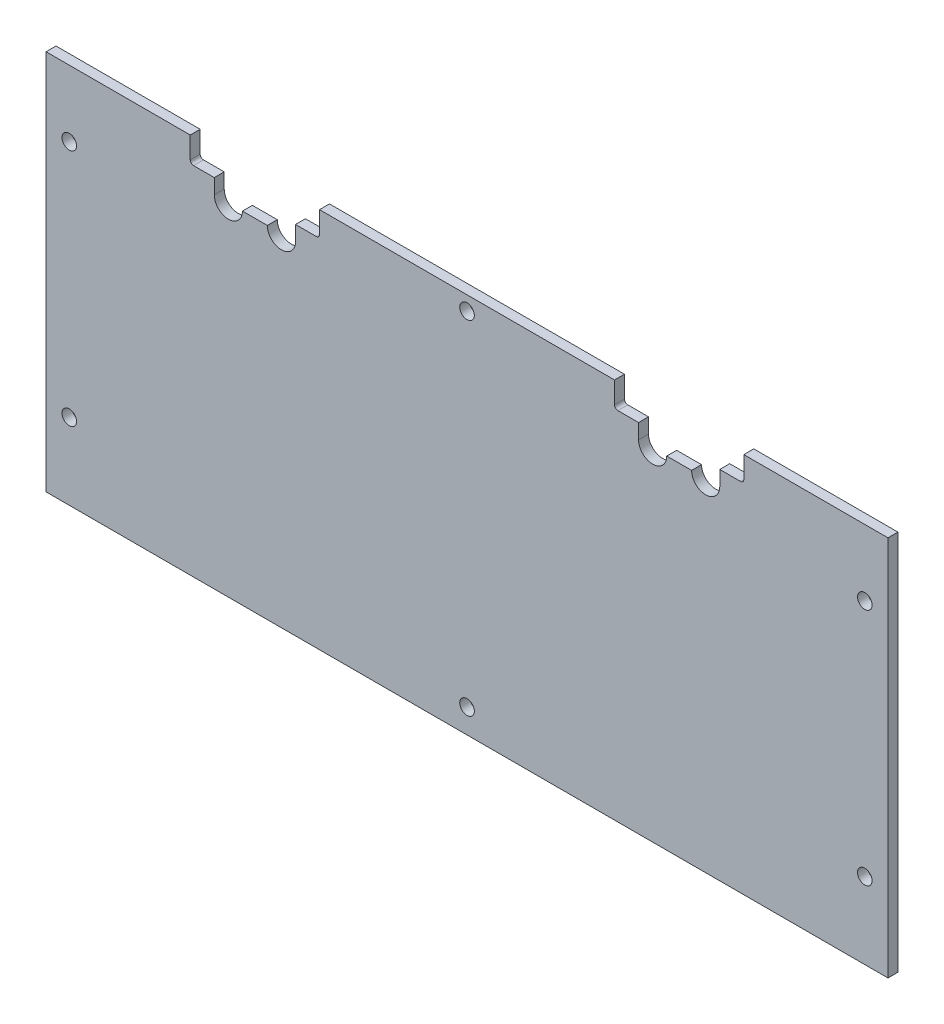
ISO-10303-21;
HEADER;
FILE_DESCRIPTION(('STEP AP214'),'2;1');
FILE_NAME('part.step','',(''),(''),'','','');
FILE_SCHEMA(('AUTOMOTIVE_DESIGN { 1 0 10303 214 1 1 1 1 }'));
ENDSEC;
DATA;
#1=APPLICATION_CONTEXT('core data for automotive mechanical design processes');
#2=APPLICATION_PROTOCOL_DEFINITION('international standard','automotive_design',2000,#1);
#3=PRODUCT_CONTEXT('',#1,'mechanical');
#4=PRODUCT('Part','Part','',(#3));
#5=PRODUCT_RELATED_PRODUCT_CATEGORY('part','',(#4));
#6=PRODUCT_DEFINITION_FORMATION('','',#4);
#7=PRODUCT_DEFINITION_CONTEXT('part definition',#1,'design');
#8=PRODUCT_DEFINITION('design','',#6,#7);
#9=PRODUCT_DEFINITION_SHAPE('','',#8);
#10=(LENGTH_UNIT() NAMED_UNIT(*) SI_UNIT(.MILLI.,.METRE.));
#11=(NAMED_UNIT(*) PLANE_ANGLE_UNIT() SI_UNIT($,.RADIAN.));
#12=(NAMED_UNIT(*) SI_UNIT($,.STERADIAN.) SOLID_ANGLE_UNIT());
#13=UNCERTAINTY_MEASURE_WITH_UNIT(LENGTH_MEASURE(1.E-05),#10,'distance_accuracy_value','');
#14=(GEOMETRIC_REPRESENTATION_CONTEXT(3) GLOBAL_UNCERTAINTY_ASSIGNED_CONTEXT((#13)) GLOBAL_UNIT_ASSIGNED_CONTEXT((#10,
#11,#12)) REPRESENTATION_CONTEXT('',''));
#15=CARTESIAN_POINT('',(0.,0.,0.));
#16=DIRECTION('',(0.,0.,1.));
#17=DIRECTION('',(1.,0.,0.));
#18=AXIS2_PLACEMENT_3D('',#15,#16,#17);
#19=CARTESIAN_POINT('',(83.5,56.,0.));
#20=DIRECTION('',(0.,1.,0.));
#21=DIRECTION('',(1.,0.,0.));
#22=AXIS2_PLACEMENT_3D('',#19,#20,#21);
#23=PLANE('',#22);
#24=DIRECTION('',(0.,0.,1.));
#25=VECTOR('',#24,1.);
#26=CARTESIAN_POINT('',(83.5,56.,0.));
#27=LINE('',#26,#25);
#28=CARTESIAN_POINT('',(83.5,56.,0.));
#29=VERTEX_POINT('',#28);
#30=CARTESIAN_POINT('',(83.5,56.,3.));
#31=VERTEX_POINT('',#30);
#32=EDGE_CURVE('E390',#29,#31,#27,.T.);
#33=ORIENTED_EDGE('',*,*,#32,.T.);
#34=DIRECTION('',(1.,0.,0.));
#35=VECTOR('',#34,1.);
#36=CARTESIAN_POINT('',(83.5,56.,3.));
#37=LINE('',#36,#35);
#38=CARTESIAN_POINT('',(127.,56.,3.));
#39=VERTEX_POINT('',#38);
#40=EDGE_CURVE('E372',#31,#39,#37,.T.);
#41=ORIENTED_EDGE('',*,*,#40,.T.);
#42=DIRECTION('',(0.,0.,1.));
#43=VECTOR('',#42,1.);
#44=CARTESIAN_POINT('',(127.,56.,0.));
#45=LINE('',#44,#43);
#46=CARTESIAN_POINT('',(127.,56.,0.));
#47=VERTEX_POINT('',#46);
#48=EDGE_CURVE('E11',#47,#39,#45,.T.);
#49=ORIENTED_EDGE('',*,*,#48,.F.);
#50=DIRECTION('',(1.,0.,0.));
#51=VECTOR('',#50,1.);
#52=CARTESIAN_POINT('',(83.5,56.,0.));
#53=LINE('',#52,#51);
#54=EDGE_CURVE('E412',#29,#47,#53,.T.);
#55=ORIENTED_EDGE('',*,*,#54,.F.);
#56=EDGE_LOOP('',(#33,#41,#49,#55));
#57=FACE_BOUND('',#56,.T.);
#58=ADVANCED_FACE('F17',(#57),#23,.T.);
#59=CARTESIAN_POINT('',(127.,56.,0.));
#60=DIRECTION('',(1.,0.,0.));
#61=DIRECTION('',(0.,1.,0.));
#62=AXIS2_PLACEMENT_3D('',#59,#60,#61);
#63=PLANE('',#62);
#64=ORIENTED_EDGE('',*,*,#48,.T.);
#65=DIRECTION('',(0.,-1.,0.));
#66=VECTOR('',#65,1.);
#67=CARTESIAN_POINT('',(127.,56.,3.));
#68=LINE('',#67,#66);
#69=CARTESIAN_POINT('',(127.,-59.,3.));
#70=VERTEX_POINT('',#69);
#71=EDGE_CURVE('E368',#39,#70,#68,.T.);
#72=ORIENTED_EDGE('',*,*,#71,.T.);
#73=DIRECTION('',(0.,0.,1.));
#74=VECTOR('',#73,1.);
#75=CARTESIAN_POINT('',(127.,-59.,0.));
#76=LINE('',#75,#74);
#77=CARTESIAN_POINT('',(127.,-59.,0.));
#78=VERTEX_POINT('',#77);
#79=EDGE_CURVE('E27',#78,#70,#76,.T.);
#80=ORIENTED_EDGE('',*,*,#79,.F.);
#81=DIRECTION('',(0.,-1.,0.));
#82=VECTOR('',#81,1.);
#83=CARTESIAN_POINT('',(127.,56.,0.));
#84=LINE('',#83,#82);
#85=EDGE_CURVE('E416',#47,#78,#84,.T.);
#86=ORIENTED_EDGE('',*,*,#85,.F.);
#87=EDGE_LOOP('',(#64,#72,#80,#86));
#88=FACE_BOUND('',#87,.T.);
#89=ADVANCED_FACE('F1040',(#88),#63,.T.);
#90=CARTESIAN_POINT('',(127.,-59.,0.));
#91=DIRECTION('',(0.,-1.,0.));
#92=DIRECTION('',(0.,0.,-1.));
#93=AXIS2_PLACEMENT_3D('',#90,#91,#92);
#94=PLANE('',#93);
#95=ORIENTED_EDGE('',*,*,#79,.T.);
#96=DIRECTION('',(-1.,0.,0.));
#97=VECTOR('',#96,1.);
#98=CARTESIAN_POINT('',(127.,-59.,3.));
#99=LINE('',#98,#97);
#100=CARTESIAN_POINT('',(-127.,-59.,3.));
#101=VERTEX_POINT('',#100);
#102=EDGE_CURVE('E364',#70,#101,#99,.T.);
#103=ORIENTED_EDGE('',*,*,#102,.T.);
#104=DIRECTION('',(0.,0.,1.));
#105=VECTOR('',#104,1.);
#106=CARTESIAN_POINT('',(-127.,-59.,0.));
#107=LINE('',#106,#105);
#108=CARTESIAN_POINT('',(-127.,-59.,0.));
#109=VERTEX_POINT('',#108);
#110=EDGE_CURVE('E21',#109,#101,#107,.T.);
#111=ORIENTED_EDGE('',*,*,#110,.F.);
#112=DIRECTION('',(-1.,0.,0.));
#113=VECTOR('',#112,1.);
#114=CARTESIAN_POINT('',(127.,-59.,0.));
#115=LINE('',#114,#113);
#116=EDGE_CURVE('E422',#78,#109,#115,.T.);
#117=ORIENTED_EDGE('',*,*,#116,.F.);
#118=EDGE_LOOP('',(#95,#103,#111,#117));
#119=FACE_BOUND('',#118,.T.);
#120=ADVANCED_FACE('F1047',(#119),#94,.T.);
#121=CARTESIAN_POINT('',(-127.,-59.,0.));
#122=DIRECTION('',(-1.,0.,0.));
#123=DIRECTION('',(0.,0.,1.));
#124=AXIS2_PLACEMENT_3D('',#121,#122,#123);
#125=PLANE('',#124);
#126=ORIENTED_EDGE('',*,*,#110,.T.);
#127=DIRECTION('',(0.,1.,0.));
#128=VECTOR('',#127,1.);
#129=CARTESIAN_POINT('',(-127.,-59.,3.));
#130=LINE('',#129,#128);
#131=CARTESIAN_POINT('',(-127.,56.,3.));
#132=VERTEX_POINT('',#131);
#133=EDGE_CURVE('E360',#101,#132,#130,.T.);
#134=ORIENTED_EDGE('',*,*,#133,.T.);
#135=DIRECTION('',(0.,0.,1.));
#136=VECTOR('',#135,1.);
#137=CARTESIAN_POINT('',(-127.,56.,0.));
#138=LINE('',#137,#136);
#139=CARTESIAN_POINT('',(-127.,56.,0.));
#140=VERTEX_POINT('',#139);
#141=EDGE_CURVE('E427',#140,#132,#138,.T.);
#142=ORIENTED_EDGE('',*,*,#141,.F.);
#143=DIRECTION('',(0.,1.,0.));
#144=VECTOR('',#143,1.);
#145=CARTESIAN_POINT('',(-127.,-59.,0.));
#146=LINE('',#145,#144);
#147=EDGE_CURVE('E417',#109,#140,#146,.T.);
#148=ORIENTED_EDGE('',*,*,#147,.F.);
#149=EDGE_LOOP('',(#126,#134,#142,#148));
#150=FACE_BOUND('',#149,.T.);
#151=ADVANCED_FACE('F19',(#150),#125,.T.);
#152=CARTESIAN_POINT('',(83.5,56.,0.));
#153=DIRECTION('',(0.,1.,0.));
#154=DIRECTION('',(1.,0.,0.));
#155=AXIS2_PLACEMENT_3D('',#152,#153,#154);
#156=PLANE('',#155);
#157=ORIENTED_EDGE('',*,*,#141,.T.);
#158=DIRECTION('',(1.,0.,0.));
#159=VECTOR('',#158,1.);
#160=CARTESIAN_POINT('',(83.5,56.,3.));
#161=LINE('',#160,#159);
#162=CARTESIAN_POINT('',(-83.5,56.,3.));
#163=VERTEX_POINT('',#162);
#164=EDGE_CURVE('E356',#132,#163,#161,.T.);
#165=ORIENTED_EDGE('',*,*,#164,.T.);
#166=DIRECTION('',(0.,0.,1.));
#167=VECTOR('',#166,1.);
#168=CARTESIAN_POINT('',(-83.5,56.,0.));
#169=LINE('',#168,#167);
#170=CARTESIAN_POINT('',(-83.5,56.,0.));
#171=VERTEX_POINT('',#170);
#172=EDGE_CURVE('E430',#171,#163,#169,.T.);
#173=ORIENTED_EDGE('',*,*,#172,.F.);
#174=DIRECTION('',(1.,0.,0.));
#175=VECTOR('',#174,1.);
#176=CARTESIAN_POINT('',(0.,56.,0.));
#177=LINE('',#176,#175);
#178=EDGE_CURVE('E421',#140,#171,#177,.T.);
#179=ORIENTED_EDGE('',*,*,#178,.F.);
#180=EDGE_LOOP('',(#157,#165,#173,#179));
#181=FACE_BOUND('',#180,.T.);
#182=ADVANCED_FACE('F1116',(#181),#156,.T.);
#183=CARTESIAN_POINT('',(-83.5,56.,0.));
#184=DIRECTION('',(1.,0.,0.));
#185=DIRECTION('',(0.,1.,0.));
#186=AXIS2_PLACEMENT_3D('',#183,#184,#185);
#187=PLANE('',#186);
#188=ORIENTED_EDGE('',*,*,#172,.T.);
#189=DIRECTION('',(0.,-1.,0.));
#190=VECTOR('',#189,1.);
#191=CARTESIAN_POINT('',(-83.5,56.,3.));
#192=LINE('',#191,#190);
#193=CARTESIAN_POINT('',(-83.5,49.5,3.));
#194=VERTEX_POINT('',#193);
#195=EDGE_CURVE('E336',#163,#194,#192,.T.);
#196=ORIENTED_EDGE('',*,*,#195,.T.);
#197=DIRECTION('',(0.,0.,1.));
#198=VECTOR('',#197,1.);
#199=CARTESIAN_POINT('',(-83.5,49.5,0.));
#200=LINE('',#199,#198);
#201=CARTESIAN_POINT('',(-83.5,49.5,0.));
#202=VERTEX_POINT('',#201);
#203=EDGE_CURVE('E327',#202,#194,#200,.T.);
#204=ORIENTED_EDGE('',*,*,#203,.F.);
#205=DIRECTION('',(0.,-1.,0.));
#206=VECTOR('',#205,1.);
#207=CARTESIAN_POINT('',(-83.5,56.,0.));
#208=LINE('',#207,#206);
#209=EDGE_CURVE('E426',#171,#202,#208,.T.);
#210=ORIENTED_EDGE('',*,*,#209,.F.);
#211=EDGE_LOOP('',(#188,#196,#204,#210));
#212=FACE_BOUND('',#211,.T.);
#213=ADVANCED_FACE('F1112',(#212),#187,.T.);
#214=CARTESIAN_POINT('',(-82.5,49.5,0.));
#215=DIRECTION('',(0.,0.,-1.));
#216=DIRECTION('',(1.,0.,0.));
#217=AXIS2_PLACEMENT_3D('',#214,#215,#216);
#218=CYLINDRICAL_SURFACE('',#217,1.);
#219=ORIENTED_EDGE('',*,*,#203,.T.);
#220=CARTESIAN_POINT('',(-82.5,49.5,3.));
#221=DIRECTION('',(0.,0.,1.));
#222=DIRECTION('',(1.,0.,0.));
#223=AXIS2_PLACEMENT_3D('',#220,#221,#222);
#224=CIRCLE('',#223,1.);
#225=CARTESIAN_POINT('',(-82.5,48.5,3.));
#226=VERTEX_POINT('',#225);
#227=EDGE_CURVE('E330',#194,#226,#224,.T.);
#228=ORIENTED_EDGE('',*,*,#227,.T.);
#229=DIRECTION('',(0.,0.,1.));
#230=VECTOR('',#229,1.);
#231=CARTESIAN_POINT('',(-82.5,48.5,0.));
#232=LINE('',#231,#230);
#233=CARTESIAN_POINT('',(-82.5,48.5,0.));
#234=VERTEX_POINT('',#233);
#235=EDGE_CURVE('E315',#234,#226,#232,.T.);
#236=ORIENTED_EDGE('',*,*,#235,.F.);
#237=CARTESIAN_POINT('',(-82.5,49.5,0.));
#238=DIRECTION('',(0.,0.,1.));
#239=DIRECTION('',(1.,0.,0.));
#240=AXIS2_PLACEMENT_3D('',#237,#238,#239);
#241=CIRCLE('',#240,1.);
#242=EDGE_CURVE('E434',#202,#234,#241,.T.);
#243=ORIENTED_EDGE('',*,*,#242,.F.);
#244=EDGE_LOOP('',(#219,#228,#236,#243));
#245=FACE_BOUND('',#244,.T.);
#246=ADVANCED_FACE('F331',(#245),#218,.F.);
#247=CARTESIAN_POINT('',(-82.5,48.5,0.));
#248=DIRECTION('',(0.,1.,0.));
#249=DIRECTION('',(1.,0.,0.));
#250=AXIS2_PLACEMENT_3D('',#247,#248,#249);
#251=PLANE('',#250);
#252=ORIENTED_EDGE('',*,*,#235,.T.);
#253=DIRECTION('',(1.,0.,0.));
#254=VECTOR('',#253,1.);
#255=CARTESIAN_POINT('',(-82.5,48.5,3.));
#256=LINE('',#255,#254);
#257=CARTESIAN_POINT('',(-76.25,48.5,3.));
#258=VERTEX_POINT('',#257);
#259=EDGE_CURVE('E319',#226,#258,#256,.T.);
#260=ORIENTED_EDGE('',*,*,#259,.T.);
#261=DIRECTION('',(0.,0.,1.));
#262=VECTOR('',#261,1.);
#263=CARTESIAN_POINT('',(-76.25,48.5,0.));
#264=LINE('',#263,#262);
#265=CARTESIAN_POINT('',(-76.25,48.5,0.));
#266=VERTEX_POINT('',#265);
#267=EDGE_CURVE('E328',#266,#258,#264,.T.);
#268=ORIENTED_EDGE('',*,*,#267,.F.);
#269=DIRECTION('',(1.,0.,0.));
#270=VECTOR('',#269,1.);
#271=CARTESIAN_POINT('',(-82.5,48.5,0.));
#272=LINE('',#271,#270);
#273=EDGE_CURVE('E322',#234,#266,#272,.T.);
#274=ORIENTED_EDGE('',*,*,#273,.F.);
#275=EDGE_LOOP('',(#252,#260,#268,#274));
#276=FACE_BOUND('',#275,.T.);
#277=ADVANCED_FACE('F317',(#276),#251,.T.);
#278=CARTESIAN_POINT('',(-76.25,48.5,0.));
#279=DIRECTION('',(1.,0.,0.));
#280=DIRECTION('',(0.,1.,0.));
#281=AXIS2_PLACEMENT_3D('',#278,#279,#280);
#282=PLANE('',#281);
#283=ORIENTED_EDGE('',*,*,#267,.T.);
#284=DIRECTION('',(0.,-1.,0.));
#285=VECTOR('',#284,1.);
#286=CARTESIAN_POINT('',(-76.25,48.5,3.));
#287=LINE('',#286,#285);
#288=CARTESIAN_POINT('',(-76.25,44.,3.));
#289=VERTEX_POINT('',#288);
#290=EDGE_CURVE('E343',#258,#289,#287,.T.);
#291=ORIENTED_EDGE('',*,*,#290,.T.);
#292=DIRECTION('',(0.,0.,1.));
#293=VECTOR('',#292,1.);
#294=CARTESIAN_POINT('',(-76.25,44.,0.));
#295=LINE('',#294,#293);
#296=CARTESIAN_POINT('',(-76.25,44.,0.));
#297=VERTEX_POINT('',#296);
#298=EDGE_CURVE('E403',#297,#289,#295,.T.);
#299=ORIENTED_EDGE('',*,*,#298,.F.);
#300=DIRECTION('',(0.,-1.,0.));
#301=VECTOR('',#300,1.);
#302=CARTESIAN_POINT('',(-76.25,48.5,0.));
#303=LINE('',#302,#301);
#304=EDGE_CURVE('E446',#266,#297,#303,.T.);
#305=ORIENTED_EDGE('',*,*,#304,.F.);
#306=EDGE_LOOP('',(#283,#291,#299,#305));
#307=FACE_BOUND('',#306,.T.);
#308=ADVANCED_FACE('F542',(#307),#282,.T.);
#309=CARTESIAN_POINT('',(-72.,44.,0.));
#310=DIRECTION('',(0.,0.,-1.));
#311=DIRECTION('',(1.,0.,0.));
#312=AXIS2_PLACEMENT_3D('',#309,#310,#311);
#313=CYLINDRICAL_SURFACE('',#312,4.25);
#314=ORIENTED_EDGE('',*,*,#298,.T.);
#315=CARTESIAN_POINT('',(-72.,44.,3.));
#316=DIRECTION('',(0.,0.,1.));
#317=DIRECTION('',(1.,0.,0.));
#318=AXIS2_PLACEMENT_3D('',#315,#316,#317);
#319=CIRCLE('',#318,4.25);
#320=CARTESIAN_POINT('',(-67.75,44.,3.));
#321=VERTEX_POINT('',#320);
#322=EDGE_CURVE('E350',#289,#321,#319,.T.);
#323=ORIENTED_EDGE('',*,*,#322,.T.);
#324=DIRECTION('',(0.,0.,1.));
#325=VECTOR('',#324,1.);
#326=CARTESIAN_POINT('',(-67.75,44.,0.));
#327=LINE('',#326,#325);
#328=CARTESIAN_POINT('',(-67.75,44.,0.));
#329=VERTEX_POINT('',#328);
#330=EDGE_CURVE('E527',#329,#321,#327,.T.);
#331=ORIENTED_EDGE('',*,*,#330,.F.);
#332=CARTESIAN_POINT('',(-72.,44.,0.));
#333=DIRECTION('',(0.,0.,1.));
#334=DIRECTION('',(1.,0.,0.));
#335=AXIS2_PLACEMENT_3D('',#332,#333,#334);
#336=CIRCLE('',#335,4.25);
#337=EDGE_CURVE('E456',#297,#329,#336,.T.);
#338=ORIENTED_EDGE('',*,*,#337,.F.);
#339=EDGE_LOOP('',(#314,#323,#331,#338));
#340=FACE_BOUND('',#339,.T.);
#341=ADVANCED_FACE('F537',(#340),#313,.F.);
#342=CARTESIAN_POINT('',(-67.75,44.,0.));
#343=DIRECTION('',(0.,1.,0.));
#344=DIRECTION('',(1.,0.,0.));
#345=AXIS2_PLACEMENT_3D('',#342,#343,#344);
#346=PLANE('',#345);
#347=ORIENTED_EDGE('',*,*,#330,.T.);
#348=DIRECTION('',(1.,0.,0.));
#349=VECTOR('',#348,1.);
#350=CARTESIAN_POINT('',(-67.75,44.,3.));
#351=LINE('',#350,#349);
#352=CARTESIAN_POINT('',(-60.25,44.,3.));
#353=VERTEX_POINT('',#352);
#354=EDGE_CURVE('E545',#321,#353,#351,.T.);
#355=ORIENTED_EDGE('',*,*,#354,.T.);
#356=DIRECTION('',(0.,0.,1.));
#357=VECTOR('',#356,1.);
#358=CARTESIAN_POINT('',(-60.25,44.,0.));
#359=LINE('',#358,#357);
#360=CARTESIAN_POINT('',(-60.25,44.,0.));
#361=VERTEX_POINT('',#360);
#362=EDGE_CURVE('E524',#361,#353,#359,.T.);
#363=ORIENTED_EDGE('',*,*,#362,.F.);
#364=DIRECTION('',(1.,0.,0.));
#365=VECTOR('',#364,1.);
#366=CARTESIAN_POINT('',(-67.75,44.,0.));
#367=LINE('',#366,#365);
#368=EDGE_CURVE('E378',#329,#361,#367,.T.);
#369=ORIENTED_EDGE('',*,*,#368,.F.);
#370=EDGE_LOOP('',(#347,#355,#363,#369));
#371=FACE_BOUND('',#370,.T.);
#372=ADVANCED_FACE('F1098',(#371),#346,.T.);
#373=CARTESIAN_POINT('',(-56.,44.,0.));
#374=DIRECTION('',(0.,0.,-1.));
#375=DIRECTION('',(1.,0.,0.));
#376=AXIS2_PLACEMENT_3D('',#373,#374,#375);
#377=CYLINDRICAL_SURFACE('',#376,4.25);
#378=ORIENTED_EDGE('',*,*,#362,.T.);
#379=CARTESIAN_POINT('',(-56.,44.,3.));
#380=DIRECTION('',(0.,0.,1.));
#381=DIRECTION('',(1.,0.,0.));
#382=AXIS2_PLACEMENT_3D('',#379,#380,#381);
#383=CIRCLE('',#382,4.25);
#384=CARTESIAN_POINT('',(-51.75,44.,3.));
#385=VERTEX_POINT('',#384);
#386=EDGE_CURVE('E551',#353,#385,#383,.T.);
#387=ORIENTED_EDGE('',*,*,#386,.T.);
#388=DIRECTION('',(0.,0.,1.));
#389=VECTOR('',#388,1.);
#390=CARTESIAN_POINT('',(-51.75,44.,0.));
#391=LINE('',#390,#389);
#392=CARTESIAN_POINT('',(-51.75,44.,0.));
#393=VERTEX_POINT('',#392);
#394=EDGE_CURVE('E528',#393,#385,#391,.T.);
#395=ORIENTED_EDGE('',*,*,#394,.F.);
#396=CARTESIAN_POINT('',(-56.,44.,0.));
#397=DIRECTION('',(0.,0.,1.));
#398=DIRECTION('',(1.,0.,0.));
#399=AXIS2_PLACEMENT_3D('',#396,#397,#398);
#400=CIRCLE('',#399,4.25);
#401=EDGE_CURVE('E373',#361,#393,#400,.T.);
#402=ORIENTED_EDGE('',*,*,#401,.F.);
#403=EDGE_LOOP('',(#378,#387,#395,#402));
#404=FACE_BOUND('',#403,.T.);
#405=ADVANCED_FACE('F1068',(#404),#377,.F.);
#406=CARTESIAN_POINT('',(-51.75,48.5,0.));
#407=DIRECTION('',(1.,0.,0.));
#408=DIRECTION('',(0.,1.,0.));
#409=AXIS2_PLACEMENT_3D('',#406,#407,#408);
#410=PLANE('',#409);
#411=DIRECTION('',(0.,-1.,0.));
#412=VECTOR('',#411,1.);
#413=CARTESIAN_POINT('',(-51.75,48.5,0.));
#414=LINE('',#413,#412);
#415=CARTESIAN_POINT('',(-51.75,48.5,0.));
#416=VERTEX_POINT('',#415);
#417=EDGE_CURVE('E377',#416,#393,#414,.T.);
#418=ORIENTED_EDGE('',*,*,#417,.T.);
#419=ORIENTED_EDGE('',*,*,#394,.T.);
#420=DIRECTION('',(0.,-1.,0.));
#421=VECTOR('',#420,1.);
#422=CARTESIAN_POINT('',(-51.75,48.5,3.));
#423=LINE('',#422,#421);
#424=CARTESIAN_POINT('',(-51.75,48.5,3.));
#425=VERTEX_POINT('',#424);
#426=EDGE_CURVE('E575',#425,#385,#423,.T.);
#427=ORIENTED_EDGE('',*,*,#426,.F.);
#428=DIRECTION('',(0.,0.,1.));
#429=VECTOR('',#428,1.);
#430=CARTESIAN_POINT('',(-51.75,48.5,0.));
#431=LINE('',#430,#429);
#432=EDGE_CURVE('E523',#416,#425,#431,.T.);
#433=ORIENTED_EDGE('',*,*,#432,.F.);
#434=EDGE_LOOP('',(#418,#419,#427,#433));
#435=FACE_BOUND('',#434,.T.);
#436=ADVANCED_FACE('F1064',(#435),#410,.F.);
#437=CARTESIAN_POINT('',(-82.5,48.5,0.));
#438=DIRECTION('',(0.,1.,0.));
#439=DIRECTION('',(1.,0.,0.));
#440=AXIS2_PLACEMENT_3D('',#437,#438,#439);
#441=PLANE('',#440);
#442=ORIENTED_EDGE('',*,*,#432,.T.);
#443=DIRECTION('',(1.,0.,0.));
#444=VECTOR('',#443,1.);
#445=CARTESIAN_POINT('',(-82.5,48.5,3.));
#446=LINE('',#445,#444);
#447=CARTESIAN_POINT('',(-45.5,48.5,3.));
#448=VERTEX_POINT('',#447);
#449=EDGE_CURVE('E571',#425,#448,#446,.T.);
#450=ORIENTED_EDGE('',*,*,#449,.T.);
#451=DIRECTION('',(0.,0.,1.));
#452=VECTOR('',#451,1.);
#453=CARTESIAN_POINT('',(-45.5,48.5,0.));
#454=LINE('',#453,#452);
#455=CARTESIAN_POINT('',(-45.5,48.5,0.));
#456=VERTEX_POINT('',#455);
#457=EDGE_CURVE('E438',#456,#448,#454,.T.);
#458=ORIENTED_EDGE('',*,*,#457,.F.);
#459=DIRECTION('',(1.,0.,0.));
#460=VECTOR('',#459,1.);
#461=CARTESIAN_POINT('',(0.,48.5,0.));
#462=LINE('',#461,#460);
#463=EDGE_CURVE('E461',#416,#456,#462,.T.);
#464=ORIENTED_EDGE('',*,*,#463,.F.);
#465=EDGE_LOOP('',(#442,#450,#458,#464));
#466=FACE_BOUND('',#465,.T.);
#467=ADVANCED_FACE('F1067',(#466),#441,.T.);
#468=CARTESIAN_POINT('',(-45.5,49.5,0.));
#469=DIRECTION('',(0.,0.,-1.));
#470=DIRECTION('',(1.,0.,0.));
#471=AXIS2_PLACEMENT_3D('',#468,#469,#470);
#472=CYLINDRICAL_SURFACE('',#471,1.);
#473=ORIENTED_EDGE('',*,*,#457,.T.);
#474=CARTESIAN_POINT('',(-45.5,49.5,3.));
#475=DIRECTION('',(0.,0.,1.));
#476=DIRECTION('',(1.,0.,0.));
#477=AXIS2_PLACEMENT_3D('',#474,#475,#476);
#478=CIRCLE('',#477,1.);
#479=CARTESIAN_POINT('',(-44.5,49.5,3.));
#480=VERTEX_POINT('',#479);
#481=EDGE_CURVE('E567',#448,#480,#478,.T.);
#482=ORIENTED_EDGE('',*,*,#481,.T.);
#483=DIRECTION('',(0.,0.,1.));
#484=VECTOR('',#483,1.);
#485=CARTESIAN_POINT('',(-44.5,49.5,0.));
#486=LINE('',#485,#484);
#487=CARTESIAN_POINT('',(-44.5,49.5,0.));
#488=VERTEX_POINT('',#487);
#489=EDGE_CURVE('E435',#488,#480,#486,.T.);
#490=ORIENTED_EDGE('',*,*,#489,.F.);
#491=CARTESIAN_POINT('',(-45.5,49.5,0.));
#492=DIRECTION('',(0.,0.,1.));
#493=DIRECTION('',(1.,0.,0.));
#494=AXIS2_PLACEMENT_3D('',#491,#492,#493);
#495=CIRCLE('',#494,1.);
#496=EDGE_CURVE('E457',#456,#488,#495,.T.);
#497=ORIENTED_EDGE('',*,*,#496,.F.);
#498=EDGE_LOOP('',(#473,#482,#490,#497));
#499=FACE_BOUND('',#498,.T.);
#500=ADVANCED_FACE('F1091',(#499),#472,.F.);
#501=CARTESIAN_POINT('',(-44.5,56.,0.));
#502=DIRECTION('',(1.,0.,0.));
#503=DIRECTION('',(0.,1.,0.));
#504=AXIS2_PLACEMENT_3D('',#501,#502,#503);
#505=PLANE('',#504);
#506=DIRECTION('',(0.,-1.,0.));
#507=VECTOR('',#506,1.);
#508=CARTESIAN_POINT('',(-44.5,56.,0.));
#509=LINE('',#508,#507);
#510=CARTESIAN_POINT('',(-44.5,56.,0.));
#511=VERTEX_POINT('',#510);
#512=EDGE_CURVE('E452',#511,#488,#509,.T.);
#513=ORIENTED_EDGE('',*,*,#512,.T.);
#514=ORIENTED_EDGE('',*,*,#489,.T.);
#515=DIRECTION('',(0.,-1.,0.));
#516=VECTOR('',#515,1.);
#517=CARTESIAN_POINT('',(-44.5,56.,3.));
#518=LINE('',#517,#516);
#519=CARTESIAN_POINT('',(-44.5,56.,3.));
#520=VERTEX_POINT('',#519);
#521=EDGE_CURVE('E561',#520,#480,#518,.T.);
#522=ORIENTED_EDGE('',*,*,#521,.F.);
#523=DIRECTION('',(0.,0.,1.));
#524=VECTOR('',#523,1.);
#525=CARTESIAN_POINT('',(-44.5,56.,0.));
#526=LINE('',#525,#524);
#527=EDGE_CURVE('E439',#511,#520,#526,.T.);
#528=ORIENTED_EDGE('',*,*,#527,.F.);
#529=EDGE_LOOP('',(#513,#514,#522,#528));
#530=FACE_BOUND('',#529,.T.);
#531=ADVANCED_FACE('F1087',(#530),#505,.F.);
#532=CARTESIAN_POINT('',(83.5,56.,0.));
#533=DIRECTION('',(0.,1.,0.));
#534=DIRECTION('',(1.,0.,0.));
#535=AXIS2_PLACEMENT_3D('',#532,#533,#534);
#536=PLANE('',#535);
#537=ORIENTED_EDGE('',*,*,#527,.T.);
#538=DIRECTION('',(1.,0.,0.));
#539=VECTOR('',#538,1.);
#540=CARTESIAN_POINT('',(83.5,56.,3.));
#541=LINE('',#540,#539);
#542=CARTESIAN_POINT('',(44.5,56.,3.));
#543=VERTEX_POINT('',#542);
#544=EDGE_CURVE('E557',#520,#543,#541,.T.);
#545=ORIENTED_EDGE('',*,*,#544,.T.);
#546=DIRECTION('',(0.,0.,1.));
#547=VECTOR('',#546,1.);
#548=CARTESIAN_POINT('',(44.5,56.,0.));
#549=LINE('',#548,#547);
#550=CARTESIAN_POINT('',(44.5,56.,0.));
#551=VERTEX_POINT('',#550);
#552=EDGE_CURVE('E516',#551,#543,#549,.T.);
#553=ORIENTED_EDGE('',*,*,#552,.F.);
#554=DIRECTION('',(1.,0.,0.));
#555=VECTOR('',#554,1.);
#556=CARTESIAN_POINT('',(0.,56.,0.));
#557=LINE('',#556,#555);
#558=EDGE_CURVE('E447',#511,#551,#557,.T.);
#559=ORIENTED_EDGE('',*,*,#558,.F.);
#560=EDGE_LOOP('',(#537,#545,#553,#559));
#561=FACE_BOUND('',#560,.T.);
#562=ADVANCED_FACE('F1084',(#561),#536,.T.);
#563=CARTESIAN_POINT('',(44.5,56.,0.));
#564=DIRECTION('',(1.,0.,0.));
#565=DIRECTION('',(0.,1.,0.));
#566=AXIS2_PLACEMENT_3D('',#563,#564,#565);
#567=PLANE('',#566);
#568=ORIENTED_EDGE('',*,*,#552,.T.);
#569=DIRECTION('',(0.,-1.,0.));
#570=VECTOR('',#569,1.);
#571=CARTESIAN_POINT('',(44.5,56.,3.));
#572=LINE('',#571,#570);
#573=CARTESIAN_POINT('',(44.5,49.5,3.));
#574=VERTEX_POINT('',#573);
#575=EDGE_CURVE('E555',#543,#574,#572,.T.);
#576=ORIENTED_EDGE('',*,*,#575,.T.);
#577=DIRECTION('',(0.,0.,1.));
#578=VECTOR('',#577,1.);
#579=CARTESIAN_POINT('',(44.5,49.5,0.));
#580=LINE('',#579,#578);
#581=CARTESIAN_POINT('',(44.5,49.5,0.));
#582=VERTEX_POINT('',#581);
#583=EDGE_CURVE('E513',#582,#574,#580,.T.);
#584=ORIENTED_EDGE('',*,*,#583,.F.);
#585=DIRECTION('',(0.,-1.,0.));
#586=VECTOR('',#585,1.);
#587=CARTESIAN_POINT('',(44.5,56.,0.));
#588=LINE('',#587,#586);
#589=EDGE_CURVE('E451',#551,#582,#588,.T.);
#590=ORIENTED_EDGE('',*,*,#589,.F.);
#591=EDGE_LOOP('',(#568,#576,#584,#590));
#592=FACE_BOUND('',#591,.T.);
#593=ADVANCED_FACE('F723',(#592),#567,.T.);
#594=CARTESIAN_POINT('',(45.5,49.5,0.));
#595=DIRECTION('',(0.,0.,-1.));
#596=DIRECTION('',(1.,0.,0.));
#597=AXIS2_PLACEMENT_3D('',#594,#595,#596);
#598=CYLINDRICAL_SURFACE('',#597,1.);
#599=ORIENTED_EDGE('',*,*,#583,.T.);
#600=CARTESIAN_POINT('',(45.5,49.5,3.));
#601=DIRECTION('',(0.,0.,1.));
#602=DIRECTION('',(1.,0.,0.));
#603=AXIS2_PLACEMENT_3D('',#600,#601,#602);
#604=CIRCLE('',#603,1.);
#605=CARTESIAN_POINT('',(45.5,48.5,3.));
#606=VERTEX_POINT('',#605);
#607=EDGE_CURVE('E634',#574,#606,#604,.T.);
#608=ORIENTED_EDGE('',*,*,#607,.T.);
#609=DIRECTION('',(0.,0.,1.));
#610=VECTOR('',#609,1.);
#611=CARTESIAN_POINT('',(45.5,48.5,0.));
#612=LINE('',#611,#610);
#613=CARTESIAN_POINT('',(45.5,48.5,0.));
#614=VERTEX_POINT('',#613);
#615=EDGE_CURVE('E476',#614,#606,#612,.T.);
#616=ORIENTED_EDGE('',*,*,#615,.F.);
#617=CARTESIAN_POINT('',(45.5,49.5,0.));
#618=DIRECTION('',(0.,0.,1.));
#619=DIRECTION('',(1.,0.,0.));
#620=AXIS2_PLACEMENT_3D('',#617,#618,#619);
#621=CIRCLE('',#620,1.);
#622=EDGE_CURVE('E465',#582,#614,#621,.T.);
#623=ORIENTED_EDGE('',*,*,#622,.F.);
#624=EDGE_LOOP('',(#599,#608,#616,#623));
#625=FACE_BOUND('',#624,.T.);
#626=ADVANCED_FACE('F719',(#625),#598,.F.);
#627=CARTESIAN_POINT('',(-82.5,48.5,0.));
#628=DIRECTION('',(0.,1.,0.));
#629=DIRECTION('',(1.,0.,0.));
#630=AXIS2_PLACEMENT_3D('',#627,#628,#629);
#631=PLANE('',#630);
#632=ORIENTED_EDGE('',*,*,#615,.T.);
#633=DIRECTION('',(1.,0.,0.));
#634=VECTOR('',#633,1.);
#635=CARTESIAN_POINT('',(-82.5,48.5,3.));
#636=LINE('',#635,#634);
#637=CARTESIAN_POINT('',(51.75,48.5,3.));
#638=VERTEX_POINT('',#637);
#639=EDGE_CURVE('E637',#606,#638,#636,.T.);
#640=ORIENTED_EDGE('',*,*,#639,.T.);
#641=DIRECTION('',(0.,0.,1.));
#642=VECTOR('',#641,1.);
#643=CARTESIAN_POINT('',(51.75,48.5,0.));
#644=LINE('',#643,#642);
#645=CARTESIAN_POINT('',(51.75,48.5,0.));
#646=VERTEX_POINT('',#645);
#647=EDGE_CURVE('E473',#646,#638,#644,.T.);
#648=ORIENTED_EDGE('',*,*,#647,.F.);
#649=DIRECTION('',(1.,0.,0.));
#650=VECTOR('',#649,1.);
#651=CARTESIAN_POINT('',(0.,48.5,0.));
#652=LINE('',#651,#650);
#653=EDGE_CURVE('E472',#614,#646,#652,.T.);
#654=ORIENTED_EDGE('',*,*,#653,.F.);
#655=EDGE_LOOP('',(#632,#640,#648,#654));
#656=FACE_BOUND('',#655,.T.);
#657=ADVANCED_FACE('F713',(#656),#631,.T.);
#658=CARTESIAN_POINT('',(51.75,48.5,0.));
#659=DIRECTION('',(1.,0.,0.));
#660=DIRECTION('',(0.,1.,0.));
#661=AXIS2_PLACEMENT_3D('',#658,#659,#660);
#662=PLANE('',#661);
#663=ORIENTED_EDGE('',*,*,#647,.T.);
#664=DIRECTION('',(0.,-1.,0.));
#665=VECTOR('',#664,1.);
#666=CARTESIAN_POINT('',(51.75,48.5,3.));
#667=LINE('',#666,#665);
#668=CARTESIAN_POINT('',(51.75,44.,3.));
#669=VERTEX_POINT('',#668);
#670=EDGE_CURVE('E597',#638,#669,#667,.T.);
#671=ORIENTED_EDGE('',*,*,#670,.T.);
#672=DIRECTION('',(0.,0.,1.));
#673=VECTOR('',#672,1.);
#674=CARTESIAN_POINT('',(51.75,44.,0.));
#675=LINE('',#674,#673);
#676=CARTESIAN_POINT('',(51.75,44.,0.));
#677=VERTEX_POINT('',#676);
#678=EDGE_CURVE('E477',#677,#669,#675,.T.);
#679=ORIENTED_EDGE('',*,*,#678,.F.);
#680=DIRECTION('',(0.,-1.,0.));
#681=VECTOR('',#680,1.);
#682=CARTESIAN_POINT('',(51.75,48.5,0.));
#683=LINE('',#682,#681);
#684=EDGE_CURVE('E481',#646,#677,#683,.T.);
#685=ORIENTED_EDGE('',*,*,#684,.F.);
#686=EDGE_LOOP('',(#663,#671,#679,#685));
#687=FACE_BOUND('',#686,.T.);
#688=ADVANCED_FACE('F709',(#687),#662,.T.);
#689=CARTESIAN_POINT('',(56.,44.,0.));
#690=DIRECTION('',(0.,0.,-1.));
#691=DIRECTION('',(1.,0.,0.));
#692=AXIS2_PLACEMENT_3D('',#689,#690,#691);
#693=CYLINDRICAL_SURFACE('',#692,4.25);
#694=ORIENTED_EDGE('',*,*,#678,.T.);
#695=CARTESIAN_POINT('',(56.,44.,3.));
#696=DIRECTION('',(0.,0.,1.));
#697=DIRECTION('',(1.,0.,0.));
#698=AXIS2_PLACEMENT_3D('',#695,#696,#697);
#699=CIRCLE('',#698,4.25);
#700=CARTESIAN_POINT('',(60.25,44.,3.));
#701=VERTEX_POINT('',#700);
#702=EDGE_CURVE('E610',#669,#701,#699,.T.);
#703=ORIENTED_EDGE('',*,*,#702,.T.);
#704=DIRECTION('',(0.,0.,1.));
#705=VECTOR('',#704,1.);
#706=CARTESIAN_POINT('',(60.25,44.,0.));
#707=LINE('',#706,#705);
#708=CARTESIAN_POINT('',(60.25,44.,0.));
#709=VERTEX_POINT('',#708);
#710=EDGE_CURVE('E508',#709,#701,#707,.T.);
#711=ORIENTED_EDGE('',*,*,#710,.F.);
#712=CARTESIAN_POINT('',(56.,44.,0.));
#713=DIRECTION('',(0.,0.,1.));
#714=DIRECTION('',(1.,0.,0.));
#715=AXIS2_PLACEMENT_3D('',#712,#713,#714);
#716=CIRCLE('',#715,4.25);
#717=EDGE_CURVE('E482',#677,#709,#716,.T.);
#718=ORIENTED_EDGE('',*,*,#717,.F.);
#719=EDGE_LOOP('',(#694,#703,#711,#718));
#720=FACE_BOUND('',#719,.T.);
#721=ADVANCED_FACE('F1077',(#720),#693,.F.);
#722=CARTESIAN_POINT('',(-67.75,44.,0.));
#723=DIRECTION('',(0.,1.,0.));
#724=DIRECTION('',(1.,0.,0.));
#725=AXIS2_PLACEMENT_3D('',#722,#723,#724);
#726=PLANE('',#725);
#727=ORIENTED_EDGE('',*,*,#710,.T.);
#728=DIRECTION('',(1.,0.,0.));
#729=VECTOR('',#728,1.);
#730=CARTESIAN_POINT('',(-67.75,44.,3.));
#731=LINE('',#730,#729);
#732=CARTESIAN_POINT('',(67.75,44.,3.));
#733=VERTEX_POINT('',#732);
#734=EDGE_CURVE('E615',#701,#733,#731,.T.);
#735=ORIENTED_EDGE('',*,*,#734,.T.);
#736=DIRECTION('',(0.,0.,1.));
#737=VECTOR('',#736,1.);
#738=CARTESIAN_POINT('',(67.75,44.,0.));
#739=LINE('',#738,#737);
#740=CARTESIAN_POINT('',(67.75,44.,0.));
#741=VERTEX_POINT('',#740);
#742=EDGE_CURVE('E386',#741,#733,#739,.T.);
#743=ORIENTED_EDGE('',*,*,#742,.F.);
#744=DIRECTION('',(1.,0.,0.));
#745=VECTOR('',#744,1.);
#746=CARTESIAN_POINT('',(0.,44.,0.));
#747=LINE('',#746,#745);
#748=EDGE_CURVE('E486',#709,#741,#747,.T.);
#749=ORIENTED_EDGE('',*,*,#748,.F.);
#750=EDGE_LOOP('',(#727,#735,#743,#749));
#751=FACE_BOUND('',#750,.T.);
#752=ADVANCED_FACE('F694',(#751),#726,.T.);
#753=CARTESIAN_POINT('',(72.,44.,0.));
#754=DIRECTION('',(0.,0.,-1.));
#755=DIRECTION('',(1.,0.,0.));
#756=AXIS2_PLACEMENT_3D('',#753,#754,#755);
#757=CYLINDRICAL_SURFACE('',#756,4.25);
#758=ORIENTED_EDGE('',*,*,#742,.T.);
#759=CARTESIAN_POINT('',(72.,44.,3.));
#760=DIRECTION('',(0.,0.,1.));
#761=DIRECTION('',(1.,0.,0.));
#762=AXIS2_PLACEMENT_3D('',#759,#760,#761);
#763=CIRCLE('',#762,4.25);
#764=CARTESIAN_POINT('',(76.25,44.,3.));
#765=VERTEX_POINT('',#764);
#766=EDGE_CURVE('E618',#733,#765,#763,.T.);
#767=ORIENTED_EDGE('',*,*,#766,.T.);
#768=DIRECTION('',(0.,0.,1.));
#769=VECTOR('',#768,1.);
#770=CARTESIAN_POINT('',(76.25,44.,0.));
#771=LINE('',#770,#769);
#772=CARTESIAN_POINT('',(76.25,44.,0.));
#773=VERTEX_POINT('',#772);
#774=EDGE_CURVE('E383',#773,#765,#771,.T.);
#775=ORIENTED_EDGE('',*,*,#774,.F.);
#776=CARTESIAN_POINT('',(72.,44.,0.));
#777=DIRECTION('',(0.,0.,1.));
#778=DIRECTION('',(1.,0.,0.));
#779=AXIS2_PLACEMENT_3D('',#776,#777,#778);
#780=CIRCLE('',#779,4.25);
#781=EDGE_CURVE('E490',#741,#773,#780,.T.);
#782=ORIENTED_EDGE('',*,*,#781,.F.);
#783=EDGE_LOOP('',(#758,#767,#775,#782));
#784=FACE_BOUND('',#783,.T.);
#785=ADVANCED_FACE('F688',(#784),#757,.F.);
#786=CARTESIAN_POINT('',(76.25,48.5,0.));
#787=DIRECTION('',(1.,0.,0.));
#788=DIRECTION('',(0.,1.,0.));
#789=AXIS2_PLACEMENT_3D('',#786,#787,#788);
#790=PLANE('',#789);
#791=DIRECTION('',(0.,-1.,0.));
#792=VECTOR('',#791,1.);
#793=CARTESIAN_POINT('',(76.25,48.5,0.));
#794=LINE('',#793,#792);
#795=CARTESIAN_POINT('',(76.25,48.5,0.));
#796=VERTEX_POINT('',#795);
#797=EDGE_CURVE('E397',#796,#773,#794,.T.);
#798=ORIENTED_EDGE('',*,*,#797,.T.);
#799=ORIENTED_EDGE('',*,*,#774,.T.);
#800=DIRECTION('',(0.,-1.,0.));
#801=VECTOR('',#800,1.);
#802=CARTESIAN_POINT('',(76.25,48.5,3.));
#803=LINE('',#802,#801);
#804=CARTESIAN_POINT('',(76.25,48.5,3.));
#805=VERTEX_POINT('',#804);
#806=EDGE_CURVE('E640',#805,#765,#803,.T.);
#807=ORIENTED_EDGE('',*,*,#806,.F.);
#808=DIRECTION('',(0.,0.,1.));
#809=VECTOR('',#808,1.);
#810=CARTESIAN_POINT('',(76.25,48.5,0.));
#811=LINE('',#810,#809);
#812=EDGE_CURVE('E387',#796,#805,#811,.T.);
#813=ORIENTED_EDGE('',*,*,#812,.F.);
#814=EDGE_LOOP('',(#798,#799,#807,#813));
#815=FACE_BOUND('',#814,.T.);
#816=ADVANCED_FACE('F686',(#815),#790,.F.);
#817=CARTESIAN_POINT('',(-82.5,48.5,0.));
#818=DIRECTION('',(0.,1.,0.));
#819=DIRECTION('',(1.,0.,0.));
#820=AXIS2_PLACEMENT_3D('',#817,#818,#819);
#821=PLANE('',#820);
#822=ORIENTED_EDGE('',*,*,#812,.T.);
#823=DIRECTION('',(1.,0.,0.));
#824=VECTOR('',#823,1.);
#825=CARTESIAN_POINT('',(-82.5,48.5,3.));
#826=LINE('',#825,#824);
#827=CARTESIAN_POINT('',(82.5,48.5,3.));
#828=VERTEX_POINT('',#827);
#829=EDGE_CURVE('E632',#805,#828,#826,.T.);
#830=ORIENTED_EDGE('',*,*,#829,.T.);
#831=DIRECTION('',(0.,0.,1.));
#832=VECTOR('',#831,1.);
#833=CARTESIAN_POINT('',(82.5,48.5,0.));
#834=LINE('',#833,#832);
#835=CARTESIAN_POINT('',(82.5,48.5,0.));
#836=VERTEX_POINT('',#835);
#837=EDGE_CURVE('E50',#836,#828,#834,.T.);
#838=ORIENTED_EDGE('',*,*,#837,.F.);
#839=DIRECTION('',(1.,0.,0.));
#840=VECTOR('',#839,1.);
#841=CARTESIAN_POINT('',(0.,48.5,0.));
#842=LINE('',#841,#840);
#843=EDGE_CURVE('E392',#796,#836,#842,.T.);
#844=ORIENTED_EDGE('',*,*,#843,.F.);
#845=EDGE_LOOP('',(#822,#830,#838,#844));
#846=FACE_BOUND('',#845,.T.);
#847=ADVANCED_FACE('F683',(#846),#821,.T.);
#848=CARTESIAN_POINT('',(82.5,49.5,0.));
#849=DIRECTION('',(0.,0.,-1.));
#850=DIRECTION('',(1.,0.,0.));
#851=AXIS2_PLACEMENT_3D('',#848,#849,#850);
#852=CYLINDRICAL_SURFACE('',#851,1.);
#853=ORIENTED_EDGE('',*,*,#837,.T.);
#854=CARTESIAN_POINT('',(82.5,49.5,3.));
#855=DIRECTION('',(0.,0.,1.));
#856=DIRECTION('',(1.,0.,0.));
#857=AXIS2_PLACEMENT_3D('',#854,#855,#856);
#858=CIRCLE('',#857,1.);
#859=CARTESIAN_POINT('',(83.5,49.5,3.));
#860=VERTEX_POINT('',#859);
#861=EDGE_CURVE('E653',#828,#860,#858,.T.);
#862=ORIENTED_EDGE('',*,*,#861,.T.);
#863=DIRECTION('',(0.,0.,1.));
#864=VECTOR('',#863,1.);
#865=CARTESIAN_POINT('',(83.5,49.5,0.));
#866=LINE('',#865,#864);
#867=CARTESIAN_POINT('',(83.5,49.5,0.));
#868=VERTEX_POINT('',#867);
#869=EDGE_CURVE('E40',#868,#860,#866,.T.);
#870=ORIENTED_EDGE('',*,*,#869,.F.);
#871=CARTESIAN_POINT('',(82.5,49.5,0.));
#872=DIRECTION('',(0.,0.,1.));
#873=DIRECTION('',(1.,0.,0.));
#874=AXIS2_PLACEMENT_3D('',#871,#872,#873);
#875=CIRCLE('',#874,1.);
#876=EDGE_CURVE('E396',#836,#868,#875,.T.);
#877=ORIENTED_EDGE('',*,*,#876,.F.);
#878=EDGE_LOOP('',(#853,#862,#870,#877));
#879=FACE_BOUND('',#878,.T.);
#880=ADVANCED_FACE('F682',(#879),#852,.F.);
#881=CARTESIAN_POINT('',(83.5,56.,0.));
#882=DIRECTION('',(1.,0.,0.));
#883=DIRECTION('',(0.,1.,0.));
#884=AXIS2_PLACEMENT_3D('',#881,#882,#883);
#885=PLANE('',#884);
#886=DIRECTION('',(0.,-1.,0.));
#887=VECTOR('',#886,1.);
#888=CARTESIAN_POINT('',(83.5,56.,0.));
#889=LINE('',#888,#887);
#890=EDGE_CURVE('E391',#29,#868,#889,.T.);
#891=ORIENTED_EDGE('',*,*,#890,.T.);
#892=ORIENTED_EDGE('',*,*,#869,.T.);
#893=DIRECTION('',(0.,-1.,0.));
#894=VECTOR('',#893,1.);
#895=CARTESIAN_POINT('',(83.5,56.,3.));
#896=LINE('',#895,#894);
#897=EDGE_CURVE('E661',#31,#860,#896,.T.);
#898=ORIENTED_EDGE('',*,*,#897,.F.);
#899=ORIENTED_EDGE('',*,*,#32,.F.);
#900=EDGE_LOOP('',(#891,#892,#898,#899));
#901=FACE_BOUND('',#900,.T.);
#902=ADVANCED_FACE('F680',(#901),#885,.F.);
#903=CARTESIAN_POINT('',(120.,-36.,0.));
#904=DIRECTION('',(0.,0.,-1.));
#905=DIRECTION('',(1.,0.,0.));
#906=AXIS2_PLACEMENT_3D('',#903,#904,#905);
#907=CYLINDRICAL_SURFACE('',#906,2.2);
#908=CARTESIAN_POINT('',(120.,-36.,0.));
#909=DIRECTION('',(0.,0.,1.));
#910=DIRECTION('',(1.,0.,0.));
#911=AXIS2_PLACEMENT_3D('',#908,#909,#910);
#912=CIRCLE('',#911,2.2);
#913=CARTESIAN_POINT('',(122.2,-36.,0.));
#914=VERTEX_POINT('',#913);
#915=EDGE_CURVE('E411',#914,#914,#912,.T.);
#916=ORIENTED_EDGE('',*,*,#915,.F.);
#917=EDGE_LOOP('',(#916));
#918=FACE_BOUND('',#917,.T.);
#919=CARTESIAN_POINT('',(120.,-36.,3.));
#920=DIRECTION('',(0.,0.,1.));
#921=DIRECTION('',(1.,0.,0.));
#922=AXIS2_PLACEMENT_3D('',#919,#920,#921);
#923=CIRCLE('',#922,2.2);
#924=CARTESIAN_POINT('',(122.2,-36.,3.));
#925=VERTEX_POINT('',#924);
#926=EDGE_CURVE('E662',#925,#925,#923,.T.);
#927=ORIENTED_EDGE('',*,*,#926,.T.);
#928=EDGE_LOOP('',(#927));
#929=FACE_BOUND('',#928,.T.);
#930=ADVANCED_FACE('F1056',(#918,#929),#907,.F.);
#931=CARTESIAN_POINT('',(120.,36.,0.));
#932=DIRECTION('',(0.,0.,-1.));
#933=DIRECTION('',(1.,0.,0.));
#934=AXIS2_PLACEMENT_3D('',#931,#932,#933);
#935=CYLINDRICAL_SURFACE('',#934,2.2);
#936=CARTESIAN_POINT('',(120.,36.,0.));
#937=DIRECTION('',(0.,0.,1.));
#938=DIRECTION('',(1.,0.,0.));
#939=AXIS2_PLACEMENT_3D('',#936,#937,#938);
#940=CIRCLE('',#939,2.2);
#941=CARTESIAN_POINT('',(122.2,36.,0.));
#942=VERTEX_POINT('',#941);
#943=EDGE_CURVE('E407',#942,#942,#940,.T.);
#944=ORIENTED_EDGE('',*,*,#943,.F.);
#945=EDGE_LOOP('',(#944));
#946=FACE_BOUND('',#945,.T.);
#947=CARTESIAN_POINT('',(120.,36.,3.));
#948=DIRECTION('',(0.,0.,1.));
#949=DIRECTION('',(1.,0.,0.));
#950=AXIS2_PLACEMENT_3D('',#947,#948,#949);
#951=CIRCLE('',#950,2.2);
#952=CARTESIAN_POINT('',(122.2,36.,3.));
#953=VERTEX_POINT('',#952);
#954=EDGE_CURVE('E665',#953,#953,#951,.T.);
#955=ORIENTED_EDGE('',*,*,#954,.T.);
#956=EDGE_LOOP('',(#955));
#957=FACE_BOUND('',#956,.T.);
#958=ADVANCED_FACE('F1051',(#946,#957),#935,.F.);
#959=CARTESIAN_POINT('',(-120.,-36.,0.));
#960=DIRECTION('',(0.,0.,-1.));
#961=DIRECTION('',(1.,0.,0.));
#962=AXIS2_PLACEMENT_3D('',#959,#960,#961);
#963=CYLINDRICAL_SURFACE('',#962,2.2);
#964=CARTESIAN_POINT('',(-120.,-36.,0.));
#965=DIRECTION('',(0.,0.,1.));
#966=DIRECTION('',(1.,0.,0.));
#967=AXIS2_PLACEMENT_3D('',#964,#965,#966);
#968=CIRCLE('',#967,2.2);
#969=CARTESIAN_POINT('',(-117.8,-36.,0.));
#970=VERTEX_POINT('',#969);
#971=EDGE_CURVE('E404',#970,#970,#968,.T.);
#972=ORIENTED_EDGE('',*,*,#971,.F.);
#973=EDGE_LOOP('',(#972));
#974=FACE_BOUND('',#973,.T.);
#975=CARTESIAN_POINT('',(-120.,-36.,3.));
#976=DIRECTION('',(0.,0.,1.));
#977=DIRECTION('',(1.,0.,0.));
#978=AXIS2_PLACEMENT_3D('',#975,#976,#977);
#979=CIRCLE('',#978,2.2);
#980=CARTESIAN_POINT('',(-117.8,-36.,3.));
#981=VERTEX_POINT('',#980);
#982=EDGE_CURVE('E953',#981,#981,#979,.T.);
#983=ORIENTED_EDGE('',*,*,#982,.T.);
#984=EDGE_LOOP('',(#983));
#985=FACE_BOUND('',#984,.T.);
#986=ADVANCED_FACE('F1011',(#974,#985),#963,.F.);
#987=CARTESIAN_POINT('',(-120.,36.,0.));
#988=DIRECTION('',(0.,0.,-1.));
#989=DIRECTION('',(1.,0.,0.));
#990=AXIS2_PLACEMENT_3D('',#987,#988,#989);
#991=CYLINDRICAL_SURFACE('',#990,2.2);
#992=CARTESIAN_POINT('',(-120.,36.,0.));
#993=DIRECTION('',(0.,0.,1.));
#994=DIRECTION('',(1.,0.,0.));
#995=AXIS2_PLACEMENT_3D('',#992,#993,#994);
#996=CIRCLE('',#995,2.2);
#997=CARTESIAN_POINT('',(-117.8,36.,0.));
#998=VERTEX_POINT('',#997);
#999=EDGE_CURVE('E408',#998,#998,#996,.T.);
#1000=ORIENTED_EDGE('',*,*,#999,.F.);
#1001=EDGE_LOOP('',(#1000));
#1002=FACE_BOUND('',#1001,.T.);
#1003=CARTESIAN_POINT('',(-120.,36.,3.));
#1004=DIRECTION('',(0.,0.,1.));
#1005=DIRECTION('',(1.,0.,0.));
#1006=AXIS2_PLACEMENT_3D('',#1003,#1004,#1005);
#1007=CIRCLE('',#1006,2.2);
#1008=CARTESIAN_POINT('',(-117.8,36.,3.));
#1009=VERTEX_POINT('',#1008);
#1010=EDGE_CURVE('E1000',#1009,#1009,#1007,.T.);
#1011=ORIENTED_EDGE('',*,*,#1010,.T.);
#1012=EDGE_LOOP('',(#1011));
#1013=FACE_BOUND('',#1012,.T.);
#1014=ADVANCED_FACE('F1034',(#1002,#1013),#991,.F.);
#1015=CARTESIAN_POINT('',(0.,-51.71,0.));
#1016=DIRECTION('',(0.,0.,-1.));
#1017=DIRECTION('',(1.,0.,0.));
#1018=AXIS2_PLACEMENT_3D('',#1015,#1016,#1017);
#1019=CYLINDRICAL_SURFACE('',#1018,2.2);
#1020=CARTESIAN_POINT('',(0.,-51.71,0.));
#1021=DIRECTION('',(0.,0.,1.));
#1022=DIRECTION('',(1.,0.,0.));
#1023=AXIS2_PLACEMENT_3D('',#1020,#1021,#1022);
#1024=CIRCLE('',#1023,2.2);
#1025=CARTESIAN_POINT('',(2.2,-51.71,0.));
#1026=VERTEX_POINT('',#1025);
#1027=EDGE_CURVE('E400',#1026,#1026,#1024,.T.);
#1028=ORIENTED_EDGE('',*,*,#1027,.F.);
#1029=EDGE_LOOP('',(#1028));
#1030=FACE_BOUND('',#1029,.T.);
#1031=CARTESIAN_POINT('',(0.,-51.71,3.));
#1032=DIRECTION('',(0.,0.,1.));
#1033=DIRECTION('',(1.,0.,0.));
#1034=AXIS2_PLACEMENT_3D('',#1031,#1032,#1033);
#1035=CIRCLE('',#1034,2.2);
#1036=CARTESIAN_POINT('',(2.2,-51.71,3.));
#1037=VERTEX_POINT('',#1036);
#1038=EDGE_CURVE('E995',#1037,#1037,#1035,.T.);
#1039=ORIENTED_EDGE('',*,*,#1038,.T.);
#1040=EDGE_LOOP('',(#1039));
#1041=FACE_BOUND('',#1040,.T.);
#1042=ADVANCED_FACE('F1024',(#1030,#1041),#1019,.F.);
#1043=CARTESIAN_POINT('',(0.,51.71,0.));
#1044=DIRECTION('',(0.,0.,-1.));
#1045=DIRECTION('',(1.,0.,0.));
#1046=AXIS2_PLACEMENT_3D('',#1043,#1044,#1045);
#1047=CYLINDRICAL_SURFACE('',#1046,2.2);
#1048=CARTESIAN_POINT('',(0.,51.71,0.));
#1049=DIRECTION('',(0.,0.,1.));
#1050=DIRECTION('',(1.,0.,0.));
#1051=AXIS2_PLACEMENT_3D('',#1048,#1049,#1050);
#1052=CIRCLE('',#1051,2.2);
#1053=CARTESIAN_POINT('',(2.2,51.71,0.));
#1054=VERTEX_POINT('',#1053);
#1055=EDGE_CURVE('E382',#1054,#1054,#1052,.T.);
#1056=ORIENTED_EDGE('',*,*,#1055,.F.);
#1057=EDGE_LOOP('',(#1056));
#1058=FACE_BOUND('',#1057,.T.);
#1059=CARTESIAN_POINT('',(0.,51.71,3.));
#1060=DIRECTION('',(0.,0.,1.));
#1061=DIRECTION('',(1.,0.,0.));
#1062=AXIS2_PLACEMENT_3D('',#1059,#1060,#1061);
#1063=CIRCLE('',#1062,2.2);
#1064=CARTESIAN_POINT('',(2.2,51.71,3.));
#1065=VERTEX_POINT('',#1064);
#1066=EDGE_CURVE('E991',#1065,#1065,#1063,.T.);
#1067=ORIENTED_EDGE('',*,*,#1066,.T.);
#1068=EDGE_LOOP('',(#1067));
#1069=FACE_BOUND('',#1068,.T.);
#1070=ADVANCED_FACE('F1022',(#1058,#1069),#1047,.F.);
#1071=CARTESIAN_POINT('',(0.,1.177249515207,0.));
#1072=DIRECTION('',(0.,0.,1.));
#1073=DIRECTION('',(1.,0.,0.));
#1074=AXIS2_PLACEMENT_3D('',#1071,#1072,#1073);
#1075=PLANE('',#1074);
#1076=ORIENTED_EDGE('',*,*,#54,.T.);
#1077=ORIENTED_EDGE('',*,*,#85,.T.);
#1078=ORIENTED_EDGE('',*,*,#116,.T.);
#1079=ORIENTED_EDGE('',*,*,#147,.T.);
#1080=ORIENTED_EDGE('',*,*,#178,.T.);
#1081=ORIENTED_EDGE('',*,*,#209,.T.);
#1082=ORIENTED_EDGE('',*,*,#242,.T.);
#1083=ORIENTED_EDGE('',*,*,#273,.T.);
#1084=ORIENTED_EDGE('',*,*,#304,.T.);
#1085=ORIENTED_EDGE('',*,*,#337,.T.);
#1086=ORIENTED_EDGE('',*,*,#368,.T.);
#1087=ORIENTED_EDGE('',*,*,#401,.T.);
#1088=ORIENTED_EDGE('',*,*,#417,.F.);
#1089=ORIENTED_EDGE('',*,*,#463,.T.);
#1090=ORIENTED_EDGE('',*,*,#496,.T.);
#1091=ORIENTED_EDGE('',*,*,#512,.F.);
#1092=ORIENTED_EDGE('',*,*,#558,.T.);
#1093=ORIENTED_EDGE('',*,*,#589,.T.);
#1094=ORIENTED_EDGE('',*,*,#622,.T.);
#1095=ORIENTED_EDGE('',*,*,#653,.T.);
#1096=ORIENTED_EDGE('',*,*,#684,.T.);
#1097=ORIENTED_EDGE('',*,*,#717,.T.);
#1098=ORIENTED_EDGE('',*,*,#748,.T.);
#1099=ORIENTED_EDGE('',*,*,#781,.T.);
#1100=ORIENTED_EDGE('',*,*,#797,.F.);
#1101=ORIENTED_EDGE('',*,*,#843,.T.);
#1102=ORIENTED_EDGE('',*,*,#876,.T.);
#1103=ORIENTED_EDGE('',*,*,#890,.F.);
#1104=EDGE_LOOP('',(#1076,#1077,#1078,#1079,#1080,#1081,#1082,#1083,#1084,#1085,#1086,#1087,
#1088,#1089,#1090,#1091,#1092,#1093,#1094,#1095,#1096,#1097,#1098,#1099,#1100,#1101,#1102,#1103));
#1105=FACE_BOUND('',#1104,.T.);
#1106=ORIENTED_EDGE('',*,*,#915,.T.);
#1107=EDGE_LOOP('',(#1106));
#1108=FACE_BOUND('',#1107,.T.);
#1109=ORIENTED_EDGE('',*,*,#943,.T.);
#1110=EDGE_LOOP('',(#1109));
#1111=FACE_BOUND('',#1110,.T.);
#1112=ORIENTED_EDGE('',*,*,#971,.T.);
#1113=EDGE_LOOP('',(#1112));
#1114=FACE_BOUND('',#1113,.T.);
#1115=ORIENTED_EDGE('',*,*,#999,.T.);
#1116=EDGE_LOOP('',(#1115));
#1117=FACE_BOUND('',#1116,.T.);
#1118=ORIENTED_EDGE('',*,*,#1027,.T.);
#1119=EDGE_LOOP('',(#1118));
#1120=FACE_BOUND('',#1119,.T.);
#1121=ORIENTED_EDGE('',*,*,#1055,.T.);
#1122=EDGE_LOOP('',(#1121));
#1123=FACE_BOUND('',#1122,.T.);
#1124=ADVANCED_FACE('F690',(#1105,#1108,#1111,#1114,#1117,#1120,#1123),#1075,.F.);
#1125=CARTESIAN_POINT('',(0.,1.177249515207,3.));
#1126=DIRECTION('',(0.,0.,1.));
#1127=DIRECTION('',(1.,0.,0.));
#1128=AXIS2_PLACEMENT_3D('',#1125,#1126,#1127);
#1129=PLANE('',#1128);
#1130=ORIENTED_EDGE('',*,*,#897,.T.);
#1131=ORIENTED_EDGE('',*,*,#861,.F.);
#1132=ORIENTED_EDGE('',*,*,#829,.F.);
#1133=ORIENTED_EDGE('',*,*,#806,.T.);
#1134=ORIENTED_EDGE('',*,*,#766,.F.);
#1135=ORIENTED_EDGE('',*,*,#734,.F.);
#1136=ORIENTED_EDGE('',*,*,#702,.F.);
#1137=ORIENTED_EDGE('',*,*,#670,.F.);
#1138=ORIENTED_EDGE('',*,*,#639,.F.);
#1139=ORIENTED_EDGE('',*,*,#607,.F.);
#1140=ORIENTED_EDGE('',*,*,#575,.F.);
#1141=ORIENTED_EDGE('',*,*,#544,.F.);
#1142=ORIENTED_EDGE('',*,*,#521,.T.);
#1143=ORIENTED_EDGE('',*,*,#481,.F.);
#1144=ORIENTED_EDGE('',*,*,#449,.F.);
#1145=ORIENTED_EDGE('',*,*,#426,.T.);
#1146=ORIENTED_EDGE('',*,*,#386,.F.);
#1147=ORIENTED_EDGE('',*,*,#354,.F.);
#1148=ORIENTED_EDGE('',*,*,#322,.F.);
#1149=ORIENTED_EDGE('',*,*,#290,.F.);
#1150=ORIENTED_EDGE('',*,*,#259,.F.);
#1151=ORIENTED_EDGE('',*,*,#227,.F.);
#1152=ORIENTED_EDGE('',*,*,#195,.F.);
#1153=ORIENTED_EDGE('',*,*,#164,.F.);
#1154=ORIENTED_EDGE('',*,*,#133,.F.);
#1155=ORIENTED_EDGE('',*,*,#102,.F.);
#1156=ORIENTED_EDGE('',*,*,#71,.F.);
#1157=ORIENTED_EDGE('',*,*,#40,.F.);
#1158=EDGE_LOOP('',(#1130,#1131,#1132,#1133,#1134,#1135,#1136,#1137,#1138,#1139,#1140,#1141,
#1142,#1143,#1144,#1145,#1146,#1147,#1148,#1149,#1150,#1151,#1152,#1153,#1154,#1155,#1156,#1157));
#1159=FACE_BOUND('',#1158,.T.);
#1160=ORIENTED_EDGE('',*,*,#926,.F.);
#1161=EDGE_LOOP('',(#1160));
#1162=FACE_BOUND('',#1161,.T.);
#1163=ORIENTED_EDGE('',*,*,#954,.F.);
#1164=EDGE_LOOP('',(#1163));
#1165=FACE_BOUND('',#1164,.T.);
#1166=ORIENTED_EDGE('',*,*,#982,.F.);
#1167=EDGE_LOOP('',(#1166));
#1168=FACE_BOUND('',#1167,.T.);
#1169=ORIENTED_EDGE('',*,*,#1010,.F.);
#1170=EDGE_LOOP('',(#1169));
#1171=FACE_BOUND('',#1170,.T.);
#1172=ORIENTED_EDGE('',*,*,#1038,.F.);
#1173=EDGE_LOOP('',(#1172));
#1174=FACE_BOUND('',#1173,.T.);
#1175=ORIENTED_EDGE('',*,*,#1066,.F.);
#1176=EDGE_LOOP('',(#1175));
#1177=FACE_BOUND('',#1176,.T.);
#1178=ADVANCED_FACE('F339',(#1159,#1162,#1165,#1168,#1171,#1174,#1177),#1129,.T.);
#1179=CLOSED_SHELL('',(#58,#89,#120,#151,#182,#213,#246,#277,#308,#341,#372,#405,#436,#467,#500,
#531,#562,#593,#626,#657,#688,#721,#752,#785,#816,#847,#880,#902,#930,#958,#986,#1014,#1042,
#1070,#1124,#1178));
#1180=MANIFOLD_SOLID_BREP('B1',#1179);
#1181=ADVANCED_BREP_SHAPE_REPRESENTATION('',(#18,#1180),#14);
#1182=SHAPE_DEFINITION_REPRESENTATION(#9,#1181);
ENDSEC;
END-ISO-10303-21;
